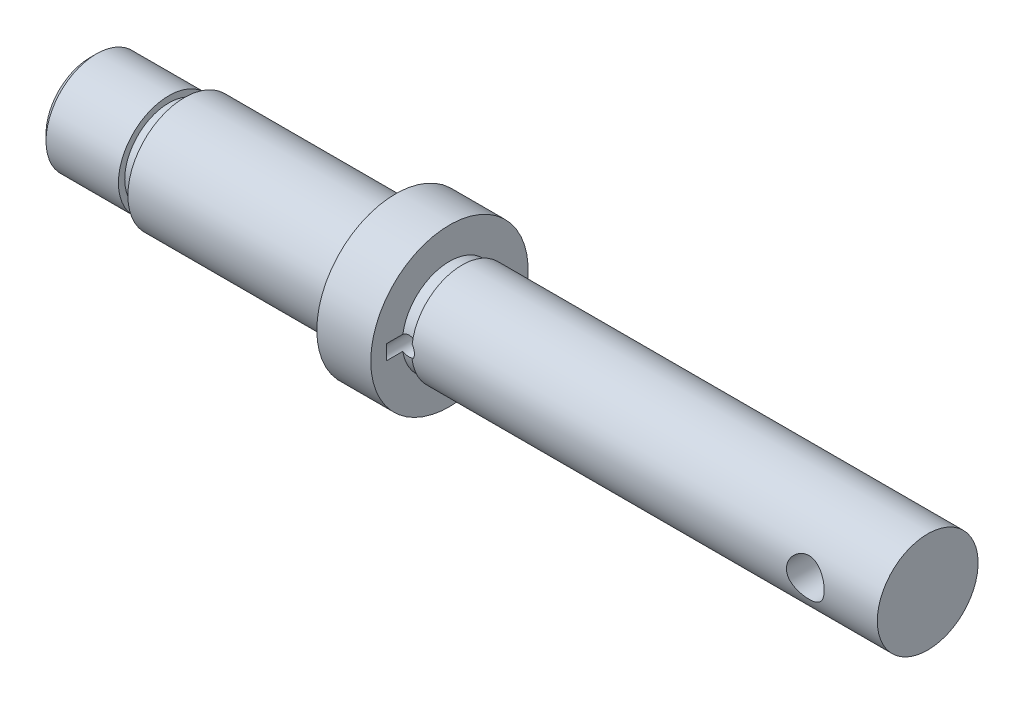
ISO-10303-21;
HEADER;
FILE_DESCRIPTION(('STEP AP214'),'2;1');
FILE_NAME('part.step','',(''),(''),'','','');
FILE_SCHEMA(('AUTOMOTIVE_DESIGN { 1 0 10303 214 1 1 1 1 }'));
ENDSEC;
DATA;
#1=APPLICATION_CONTEXT('core data for automotive mechanical design processes');
#2=APPLICATION_PROTOCOL_DEFINITION('international standard','automotive_design',2000,#1);
#3=PRODUCT_CONTEXT('',#1,'mechanical');
#4=PRODUCT('Part','Part','',(#3));
#5=PRODUCT_RELATED_PRODUCT_CATEGORY('part','',(#4));
#6=PRODUCT_DEFINITION_FORMATION('','',#4);
#7=PRODUCT_DEFINITION_CONTEXT('part definition',#1,'design');
#8=PRODUCT_DEFINITION('design','',#6,#7);
#9=PRODUCT_DEFINITION_SHAPE('','',#8);
#10=(LENGTH_UNIT() NAMED_UNIT(*) SI_UNIT(.MILLI.,.METRE.));
#11=(NAMED_UNIT(*) PLANE_ANGLE_UNIT() SI_UNIT($,.RADIAN.));
#12=(NAMED_UNIT(*) SI_UNIT($,.STERADIAN.) SOLID_ANGLE_UNIT());
#13=UNCERTAINTY_MEASURE_WITH_UNIT(LENGTH_MEASURE(1.E-05),#10,'distance_accuracy_value','');
#14=(GEOMETRIC_REPRESENTATION_CONTEXT(3) GLOBAL_UNCERTAINTY_ASSIGNED_CONTEXT((#13)) GLOBAL_UNIT_ASSIGNED_CONTEXT((#10,
#11,#12)) REPRESENTATION_CONTEXT('',''));
#15=CARTESIAN_POINT('',(0.,0.,0.));
#16=DIRECTION('',(0.,0.,1.));
#17=DIRECTION('',(1.,0.,0.));
#18=AXIS2_PLACEMENT_3D('',#15,#16,#17);
#19=CARTESIAN_POINT('',(0.,0.,0.));
#20=DIRECTION('',(-1.,0.,0.));
#21=DIRECTION('',(0.,0.,1.));
#22=AXIS2_PLACEMENT_3D('',#19,#20,#21);
#23=CYLINDRICAL_SURFACE('',#22,8.);
#24=CARTESIAN_POINT('',(0.,0.,0.));
#25=DIRECTION('',(-1.,0.,0.));
#26=DIRECTION('',(0.,0.,1.));
#27=AXIS2_PLACEMENT_3D('',#24,#25,#26);
#28=CIRCLE('',#27,8.);
#29=CARTESIAN_POINT('',(0.,0.,8.));
#30=VERTEX_POINT('',#29);
#31=EDGE_CURVE('E105',#30,#30,#28,.T.);
#32=ORIENTED_EDGE('',*,*,#31,.T.);
#33=EDGE_LOOP('',(#32));
#34=FACE_BOUND('',#33,.T.);
#35=CARTESIAN_POINT('',(-8.43488690884217,0.,-8.));
#36=CARTESIAN_POINT('',(-8.43488110423595,0.162470117875706,-8.00000434912302));
#37=CARTESIAN_POINT('',(-8.44812642933894,0.324900483563584,-7.99500758566367));
#38=CARTESIAN_POINT('',(-8.50054329938203,0.644906904704722,-7.97557392013855));
#39=CARTESIAN_POINT('',(-8.53971110978331,0.802483655975232,-7.96113837787987));
#40=CARTESIAN_POINT('',(-8.64239291238569,1.10812156998176,-7.92437664783088));
#41=CARTESIAN_POINT('',(-8.70585994248575,1.25620044832455,-7.90206568698877));
#42=CARTESIAN_POINT('',(-8.85509973487381,1.53959862032051,-7.85177535530709));
#43=CARTESIAN_POINT('',(-8.94087847993048,1.67491447835576,-7.82379446455106));
#44=CARTESIAN_POINT('',(-9.136111970984,1.93469283409165,-7.76372493942421));
#45=CARTESIAN_POINT('',(-9.24634743336101,2.05854146030237,-7.73152005167087));
#46=CARTESIAN_POINT('',(-9.48570777815983,2.28648842948728,-7.66720441742698));
#47=CARTESIAN_POINT('',(-9.6148384210178,2.39058072718411,-7.63509370270231));
#48=CARTESIAN_POINT('',(-9.89432184388871,2.57996404431964,-7.57324941235289));
#49=CARTESIAN_POINT('',(-10.0452956419343,2.66438786391495,-7.5436529764098));
#50=CARTESIAN_POINT('',(-10.3605836171788,2.80637292668193,-7.49199720475522));
#51=CARTESIAN_POINT('',(-10.5248924351506,2.86394489922567,-7.46993485954214));
#52=CARTESIAN_POINT('',(-10.8551203893602,2.94816862035013,-7.43708825645919));
#53=CARTESIAN_POINT('',(-11.0206969857191,2.97599186436803,-7.42587848693063));
#54=CARTESIAN_POINT('',(-11.3545192248238,3.00359113063608,-7.41476122931038));
#55=CARTESIAN_POINT('',(-11.5227637365685,3.00337873606425,-7.41484907350686));
#56=CARTESIAN_POINT('',(-11.8464259592993,2.97580859218857,-7.42595023233986));
#57=CARTESIAN_POINT('',(-12.0020087210274,2.95007617013711,-7.43630937632964));
#58=CARTESIAN_POINT('',(-12.3064612097447,2.87488335732475,-7.46569876010067));
#59=CARTESIAN_POINT('',(-12.4553299220912,2.82541939325577,-7.48473030568194));
#60=CARTESIAN_POINT('',(-12.7454410442687,2.70327497145115,-7.52971404410466));
#61=CARTESIAN_POINT('',(-12.8864858810767,2.63017297474552,-7.55579035984378));
#62=CARTESIAN_POINT('',(-13.1547783840322,2.46312147525044,-7.61188420270589));
#63=CARTESIAN_POINT('',(-13.2820212638838,2.36916477457696,-7.64190308912093));
#64=CARTESIAN_POINT('',(-13.5280942361416,2.15563561533201,-7.70496077720597));
#65=CARTESIAN_POINT('',(-13.6457841903377,2.03476597433939,-7.73806694911977));
#66=CARTESIAN_POINT('',(-13.8595628412544,1.77462518163777,-7.80183456327535));
#67=CARTESIAN_POINT('',(-13.9556482180537,1.63535120699465,-7.83249562931732));
#68=CARTESIAN_POINT('',(-14.124747702967,1.33944687398492,-7.88852789618334));
#69=CARTESIAN_POINT('',(-14.1973820712843,1.18258142768946,-7.91380996519278));
#70=CARTESIAN_POINT('',(-14.3148521173823,0.857673701049149,-7.95557436653877));
#71=CARTESIAN_POINT('',(-14.3597001419644,0.689636421691532,-7.97206060682974));
#72=CARTESIAN_POINT('',(-14.418132483926,0.356750486297338,-7.99368886456141));
#73=CARTESIAN_POINT('',(-14.4332521216072,0.192207239124422,-7.99938738051375));
#74=CARTESIAN_POINT('',(-14.436269036642,-0.137144950510048,-8.00051787400248));
#75=CARTESIAN_POINT('',(-14.4241723494757,-0.301953825966744,-7.99595212773725));
#76=CARTESIAN_POINT('',(-14.3742668242248,-0.620524097123716,-7.97743419545287));
#77=CARTESIAN_POINT('',(-14.337463821368,-0.77446665601467,-7.96384941924609));
#78=CARTESIAN_POINT('',(-14.2405147637475,-1.07388350991444,-7.92902954183434));
#79=CARTESIAN_POINT('',(-14.1803656729461,-1.21935670069507,-7.9077934456406));
#80=CARTESIAN_POINT('',(-14.0365140839632,-1.50249553022031,-7.85899248815363));
#81=CARTESIAN_POINT('',(-13.9521714503954,-1.63980616711559,-7.83126000418696));
#82=CARTESIAN_POINT('',(-13.7630507024991,-1.89878542345325,-7.77253343129327));
#83=CARTESIAN_POINT('',(-13.6582650437519,-2.0204482405409,-7.74153814019032));
#84=CARTESIAN_POINT('',(-13.4240786645936,-2.25206159748908,-7.67746658981979));
#85=CARTESIAN_POINT('',(-13.2936025432968,-2.36092308247137,-7.64437393007458));
#86=CARTESIAN_POINT('',(-13.0155841394269,-2.55542100063806,-7.58157631493707));
#87=CARTESIAN_POINT('',(-12.8680403260652,-2.64105534829037,-7.55187166388798));
#88=CARTESIAN_POINT('',(-12.5588549352975,-2.78675547037995,-7.49933659644926));
#89=CARTESIAN_POINT('',(-12.3971574170213,-2.84671370893836,-7.47653520656986));
#90=CARTESIAN_POINT('',(-12.0648673814665,-2.93815766933778,-7.4410806578201));
#91=CARTESIAN_POINT('',(-11.8942804364459,-2.9696610061107,-7.42842122114981));
#92=CARTESIAN_POINT('',(-11.5608545897599,-3.00172694195678,-7.41551789585146));
#93=CARTESIAN_POINT('',(-11.3982216454084,-3.00414662991675,-7.41452889046681));
#94=CARTESIAN_POINT('',(-11.0749962762898,-2.98273431283185,-7.42316825490584));
#95=CARTESIAN_POINT('',(-10.914403659499,-2.95890479700247,-7.43279561797797));
#96=CARTESIAN_POINT('',(-10.6047924554091,-2.88711631260483,-7.46096283170865));
#97=CARTESIAN_POINT('',(-10.4555702163515,-2.83991596633048,-7.47922170753325));
#98=CARTESIAN_POINT('',(-10.1670758918533,-2.72339393559839,-7.52243096595689));
#99=CARTESIAN_POINT('',(-10.0278063327019,-2.65406665889889,-7.54738303990429));
#100=CARTESIAN_POINT('',(-9.75523332944691,-2.49104151876308,-7.60279447807929));
#101=CARTESIAN_POINT('',(-9.62262531524235,-2.39625665606021,-7.63347396881928));
#102=CARTESIAN_POINT('',(-9.37460378689977,-2.18668971459812,-7.69612493514354));
#103=CARTESIAN_POINT('',(-9.25919575926867,-2.07190128025617,-7.7280968188629));
#104=CARTESIAN_POINT('',(-9.04248299719849,-1.81816079356925,-7.79180849219762));
#105=CARTESIAN_POINT('',(-8.94227940197283,-1.67823728842599,-7.82344209801289));
#106=CARTESIAN_POINT('',(-8.76684159828906,-1.38242644640164,-7.88109028914061));
#107=CARTESIAN_POINT('',(-8.69160933336943,-1.22653786818124,-7.90710443703118));
#108=CARTESIAN_POINT('',(-8.56613325074552,-0.895998164004625,-7.9514858521336));
#109=CARTESIAN_POINT('',(-8.51711277963838,-0.720826844468417,-7.96947314316712));
#110=CARTESIAN_POINT('',(-8.45150098900081,-0.363751467212764,-7.99372484359173));
#111=CARTESIAN_POINT('',(-8.43489340586753,-0.181850832729718,-7.99999513207934));
#112=CARTESIAN_POINT('',(-8.43488690884217,0.,-8.));
#113=B_SPLINE_CURVE_WITH_KNOTS('',3,(#35,#36,#37,#38,#39,#40,#41,#42,#43,#44,#45,#46,#47,#48,
#49,#50,#51,#52,#53,#54,#55,#56,#57,#58,#59,#60,#61,#62,#63,#64,#65,#66,#67,#68,#69,#70,#71,#72,
#73,#74,#75,#76,#77,#78,#79,#80,#81,#82,#83,#84,#85,#86,#87,#88,#89,#90,#91,#92,#93,#94,#95,#96,
#97,#98,#99,#100,#101,#102,#103,#104,#105,#106,#107,#108,#109,#110,#111,#112),.UNSPECIFIED.,.T.,
.F.,(4,2,2,2,2,2,2,2,2,2,2,2,2,2,2,2,2,2,2,2,2,2,2,2,2,2,2,2,2,2,2,2,2,2,2,2,2,2,4),(0.,
0.48673960312112,0.973409099060921,1.45914273842714,1.94500675921898,2.44947237165431,
2.95409209851243,3.47793349003317,4.00156538704268,4.50371748833803,5.00566212159415,
5.47756690242935,5.94954276126852,6.43044816779711,6.91151981494191,7.424923066773,
7.93840515815806,8.45982750577825,8.98101799403366,9.47450039277525,9.96787336786715,
10.4422887585335,10.9167658651458,11.4051844372487,11.8937836004541,12.4107303891699,
12.9277235784596,13.4468613346008,13.9656774991869,14.4511752696618,14.9366270042819,
15.4072628485874,15.8780177331869,16.3734494377422,16.869038839998,17.3914465931375,
17.9138949961588,18.4589703006976,19.0037720359793),.UNSPECIFIED.);
#114=CARTESIAN_POINT('',(-8.43488690884217,0.,-8.));
#115=VERTEX_POINT('',#114);
#116=EDGE_CURVE('E122',#115,#115,#113,.T.);
#117=ORIENTED_EDGE('',*,*,#116,.T.);
#118=EDGE_LOOP('',(#117));
#119=FACE_BOUND('',#118,.T.);
#120=CARTESIAN_POINT('',(-8.43488690884217,0.,8.));
#121=CARTESIAN_POINT('',(-8.43488110423595,-0.162470117875706,8.00000434912302));
#122=CARTESIAN_POINT('',(-8.44812642933894,-0.324900483563584,7.99500758566367));
#123=CARTESIAN_POINT('',(-8.50054329938203,-0.644906904704722,7.97557392013855));
#124=CARTESIAN_POINT('',(-8.53971110978331,-0.802483655975232,7.96113837787987));
#125=CARTESIAN_POINT('',(-8.64239291238569,-1.10812156998176,7.92437664783088));
#126=CARTESIAN_POINT('',(-8.70585994248575,-1.25620044832455,7.90206568698877));
#127=CARTESIAN_POINT('',(-8.85509973487381,-1.53959862032051,7.85177535530709));
#128=CARTESIAN_POINT('',(-8.94087847993048,-1.67491447835576,7.82379446455106));
#129=CARTESIAN_POINT('',(-9.136111970984,-1.93469283409165,7.76372493942421));
#130=CARTESIAN_POINT('',(-9.24634743336101,-2.05854146030237,7.73152005167087));
#131=CARTESIAN_POINT('',(-9.48570777815983,-2.28648842948728,7.66720441742698));
#132=CARTESIAN_POINT('',(-9.6148384210178,-2.39058072718411,7.63509370270231));
#133=CARTESIAN_POINT('',(-9.89432184388871,-2.57996404431964,7.57324941235289));
#134=CARTESIAN_POINT('',(-10.0452956419343,-2.66438786391495,7.5436529764098));
#135=CARTESIAN_POINT('',(-10.3605836171788,-2.80637292668193,7.49199720475522));
#136=CARTESIAN_POINT('',(-10.5248924351506,-2.86394489922567,7.46993485954214));
#137=CARTESIAN_POINT('',(-10.8551203893602,-2.94816862035013,7.43708825645919));
#138=CARTESIAN_POINT('',(-11.0206969857191,-2.97599186436803,7.42587848693063));
#139=CARTESIAN_POINT('',(-11.3545192248238,-3.00359113063608,7.41476122931038));
#140=CARTESIAN_POINT('',(-11.5227637365685,-3.00337873606425,7.41484907350686));
#141=CARTESIAN_POINT('',(-11.8464259592993,-2.97580859218857,7.42595023233986));
#142=CARTESIAN_POINT('',(-12.0020087210274,-2.95007617013711,7.43630937632964));
#143=CARTESIAN_POINT('',(-12.3064612097447,-2.87488335732475,7.46569876010067));
#144=CARTESIAN_POINT('',(-12.4553299220912,-2.82541939325577,7.48473030568194));
#145=CARTESIAN_POINT('',(-12.7454410442687,-2.70327497145115,7.52971404410466));
#146=CARTESIAN_POINT('',(-12.8864858810767,-2.63017297474552,7.55579035984378));
#147=CARTESIAN_POINT('',(-13.1547783840322,-2.46312147525044,7.61188420270589));
#148=CARTESIAN_POINT('',(-13.2820212638838,-2.36916477457696,7.64190308912093));
#149=CARTESIAN_POINT('',(-13.5280942361416,-2.15563561533201,7.70496077720597));
#150=CARTESIAN_POINT('',(-13.6457841903377,-2.03476597433939,7.73806694911977));
#151=CARTESIAN_POINT('',(-13.8595628412544,-1.77462518163777,7.80183456327535));
#152=CARTESIAN_POINT('',(-13.9556482180537,-1.63535120699465,7.83249562931732));
#153=CARTESIAN_POINT('',(-14.124747702967,-1.33944687398492,7.88852789618334));
#154=CARTESIAN_POINT('',(-14.1973820712843,-1.18258142768946,7.91380996519278));
#155=CARTESIAN_POINT('',(-14.3148521173823,-0.857673701049149,7.95557436653877));
#156=CARTESIAN_POINT('',(-14.3597001419644,-0.689636421691532,7.97206060682974));
#157=CARTESIAN_POINT('',(-14.418132483926,-0.356750486297338,7.99368886456141));
#158=CARTESIAN_POINT('',(-14.4332521216072,-0.192207239124422,7.99938738051375));
#159=CARTESIAN_POINT('',(-14.436269036642,0.137144950510048,8.00051787400248));
#160=CARTESIAN_POINT('',(-14.4241723494757,0.301953825966744,7.99595212773725));
#161=CARTESIAN_POINT('',(-14.3742668242248,0.620524097123716,7.97743419545287));
#162=CARTESIAN_POINT('',(-14.337463821368,0.77446665601467,7.96384941924609));
#163=CARTESIAN_POINT('',(-14.2405147637475,1.07388350991444,7.92902954183434));
#164=CARTESIAN_POINT('',(-14.1803656729461,1.21935670069507,7.9077934456406));
#165=CARTESIAN_POINT('',(-14.0365140839632,1.50249553022031,7.85899248815363));
#166=CARTESIAN_POINT('',(-13.9521714503954,1.63980616711559,7.83126000418696));
#167=CARTESIAN_POINT('',(-13.7630507024991,1.89878542345325,7.77253343129327));
#168=CARTESIAN_POINT('',(-13.6582650437519,2.0204482405409,7.74153814019032));
#169=CARTESIAN_POINT('',(-13.4240786645936,2.25206159748908,7.67746658981979));
#170=CARTESIAN_POINT('',(-13.2936025432968,2.36092308247137,7.64437393007458));
#171=CARTESIAN_POINT('',(-13.0155841394269,2.55542100063806,7.58157631493707));
#172=CARTESIAN_POINT('',(-12.8680403260652,2.64105534829037,7.55187166388798));
#173=CARTESIAN_POINT('',(-12.5588549352975,2.78675547037995,7.49933659644926));
#174=CARTESIAN_POINT('',(-12.3971574170213,2.84671370893836,7.47653520656986));
#175=CARTESIAN_POINT('',(-12.0648673814665,2.93815766933778,7.4410806578201));
#176=CARTESIAN_POINT('',(-11.8942804364459,2.9696610061107,7.42842122114981));
#177=CARTESIAN_POINT('',(-11.5608545897599,3.00172694195678,7.41551789585146));
#178=CARTESIAN_POINT('',(-11.3982216454084,3.00414662991675,7.41452889046681));
#179=CARTESIAN_POINT('',(-11.0749962762898,2.98273431283185,7.42316825490584));
#180=CARTESIAN_POINT('',(-10.914403659499,2.95890479700247,7.43279561797797));
#181=CARTESIAN_POINT('',(-10.6047924554091,2.88711631260483,7.46096283170865));
#182=CARTESIAN_POINT('',(-10.4555702163515,2.83991596633048,7.47922170753325));
#183=CARTESIAN_POINT('',(-10.1670758918533,2.72339393559839,7.52243096595689));
#184=CARTESIAN_POINT('',(-10.0278063327019,2.65406665889889,7.54738303990429));
#185=CARTESIAN_POINT('',(-9.75523332944691,2.49104151876308,7.60279447807929));
#186=CARTESIAN_POINT('',(-9.62262531524235,2.39625665606021,7.63347396881928));
#187=CARTESIAN_POINT('',(-9.37460378689977,2.18668971459812,7.69612493514354));
#188=CARTESIAN_POINT('',(-9.25919575926867,2.07190128025617,7.7280968188629));
#189=CARTESIAN_POINT('',(-9.04248299719849,1.81816079356925,7.79180849219762));
#190=CARTESIAN_POINT('',(-8.94227940197283,1.67823728842599,7.82344209801289));
#191=CARTESIAN_POINT('',(-8.76684159828906,1.38242644640164,7.88109028914061));
#192=CARTESIAN_POINT('',(-8.69160933336943,1.22653786818124,7.90710443703118));
#193=CARTESIAN_POINT('',(-8.56613325074552,0.895998164004625,7.9514858521336));
#194=CARTESIAN_POINT('',(-8.51711277963838,0.720826844468417,7.96947314316712));
#195=CARTESIAN_POINT('',(-8.45150098900081,0.363751467212764,7.99372484359173));
#196=CARTESIAN_POINT('',(-8.43489340586753,0.181850832729718,7.99999513207934));
#197=CARTESIAN_POINT('',(-8.43488690884217,0.,8.));
#198=B_SPLINE_CURVE_WITH_KNOTS('',3,(#120,#121,#122,#123,#124,#125,#126,#127,#128,#129,#130,
#131,#132,#133,#134,#135,#136,#137,#138,#139,#140,#141,#142,#143,#144,#145,#146,#147,#148,#149,
#150,#151,#152,#153,#154,#155,#156,#157,#158,#159,#160,#161,#162,#163,#164,#165,#166,#167,#168,
#169,#170,#171,#172,#173,#174,#175,#176,#177,#178,#179,#180,#181,#182,#183,#184,#185,#186,#187,
#188,#189,#190,#191,#192,#193,#194,#195,#196,#197),.UNSPECIFIED.,.T.,.F.,(4,2,2,2,2,2,2,2,2,2,2,
2,2,2,2,2,2,2,2,2,2,2,2,2,2,2,2,2,2,2,2,2,2,2,2,2,2,2,4),(0.,0.48673960312112,0.973409099060921,
1.45914273842714,1.94500675921898,2.44947237165431,2.95409209851243,3.47793349003317,
4.00156538704268,4.50371748833803,5.00566212159415,5.47756690242935,5.94954276126852,
6.43044816779711,6.91151981494191,7.424923066773,7.93840515815806,8.45982750577825,
8.98101799403366,9.47450039277525,9.96787336786715,10.4422887585335,10.9167658651458,
11.4051844372487,11.8937836004541,12.4107303891699,12.9277235784596,13.4468613346008,
13.9656774991869,14.4511752696618,14.9366270042819,15.4072628485874,15.8780177331869,
16.3734494377422,16.869038839998,17.3914465931375,17.9138949961588,18.4589703006976,
19.0037720359793),.UNSPECIFIED.);
#199=CARTESIAN_POINT('',(-8.43488690884217,0.,8.));
#200=VERTEX_POINT('',#199);
#201=EDGE_CURVE('E114',#200,#200,#198,.T.);
#202=ORIENTED_EDGE('',*,*,#201,.T.);
#203=EDGE_LOOP('',(#202));
#204=FACE_BOUND('',#203,.T.);
#205=CARTESIAN_POINT('',(-73.9348869088422,-1.05618847893945,7.92997262901679));
#206=CARTESIAN_POINT('',(-73.9052739556096,-1.02632416951052,7.93395026615026));
#207=CARTESIAN_POINT('',(-73.8769301635699,-0.995228402913589,7.93791992458012));
#208=CARTESIAN_POINT('',(-73.8229450184406,-0.930758570493962,7.94573753142004));
#209=CARTESIAN_POINT('',(-73.797303703623,-0.897384472417004,7.9495854781059));
#210=CARTESIAN_POINT('',(-73.724728715722,-0.79419097562321,7.96078056492474));
#211=CARTESIAN_POINT('',(-73.6820848174073,-0.721240604808903,7.96778723242894));
#212=CARTESIAN_POINT('',(-73.6095782815059,-0.569073794634865,7.98009942239746));
#213=CARTESIAN_POINT('',(-73.5797262410669,-0.489852224143204,7.98540353350535));
#214=CARTESIAN_POINT('',(-73.5337441245777,-0.327427823716092,7.99370950025806));
#215=CARTESIAN_POINT('',(-73.5176077558881,-0.244226838031143,7.99671241161244));
#216=CARTESIAN_POINT('',(-73.4996594270303,-0.0771853313498899,8.00005898376508));
#217=CARTESIAN_POINT('',(-73.4976895855359,0.00663768463714937,8.00043195348811));
#218=CARTESIAN_POINT('',(-73.5077194887055,0.17343226557318,7.99855472732908));
#219=CARTESIAN_POINT('',(-73.519721883936,0.256403665956043,7.99630403373175));
#220=CARTESIAN_POINT('',(-73.5571875424326,0.418534679332189,7.98945395382498));
#221=CARTESIAN_POINT('',(-73.5825582655844,0.497716464660166,7.98487072149909));
#222=CARTESIAN_POINT('',(-73.6459506264059,0.650689841306847,7.97386240401827));
#223=CARTESIAN_POINT('',(-73.6839671050425,0.724483615801353,7.9674380701172));
#224=CARTESIAN_POINT('',(-73.7573029173122,0.841917983630088,7.95571797405833));
#225=CARTESIAN_POINT('',(-73.7894970939228,0.887575011909834,7.95073209187361));
#226=CARTESIAN_POINT('',(-73.8586864986466,0.974939305734814,7.94049317400849));
#227=CARTESIAN_POINT('',(-73.8956738559005,1.01665285678915,7.93524058470219));
#228=CARTESIAN_POINT('',(-73.9348869088422,1.05618847893945,7.92997262901679));
#229=B_SPLINE_CURVE_WITH_KNOTS('',3,(#205,#206,#207,#208,#209,#210,#211,#212,#213,#214,#215,
#216,#217,#218,#219,#220,#221,#222,#223,#224,#225,#226,#227,#228),.UNSPECIFIED.,.F.,.F.,(4,2,2,
2,2,2,2,2,2,2,2,4),(0.,0.126657745911478,0.253317285284476,0.506385995258268,0.7596639513035,
1.01282564264968,1.26316149402208,1.51354484243904,1.76221729180274,2.0107884155307,
2.17872948218573,2.34639818764562),.UNSPECIFIED.);
#230=CARTESIAN_POINT('',(-73.9348869088422,-1.05618847893945,7.92997262901679));
#231=VERTEX_POINT('',#230);
#232=CARTESIAN_POINT('',(-73.9348869088422,1.05618847893945,7.92997262901679));
#233=VERTEX_POINT('',#232);
#234=EDGE_CURVE('E297',#231,#233,#229,.T.);
#235=ORIENTED_EDGE('',*,*,#234,.F.);
#236=CARTESIAN_POINT('',(-73.9348869088422,0.,0.));
#237=DIRECTION('',(-1.,0.,0.));
#238=DIRECTION('',(0.,0.,1.));
#239=AXIS2_PLACEMENT_3D('',#236,#237,#238);
#240=CIRCLE('',#239,7.99999999999999);
#241=EDGE_CURVE('E185',#233,#231,#240,.T.);
#242=ORIENTED_EDGE('',*,*,#241,.F.);
#243=EDGE_LOOP('',(#235,#242));
#244=FACE_BOUND('',#243,.T.);
#245=ADVANCED_FACE('F48',(#34,#119,#204,#244),#23,.T.);
#246=CARTESIAN_POINT('',(-73.9348869088422,7.99999999999999,0.));
#247=DIRECTION('',(1.,0.,0.));
#248=DIRECTION('',(0.,0.,-1.));
#249=AXIS2_PLACEMENT_3D('',#246,#247,#248);
#250=PLANE('',#249);
#251=DIRECTION('',(0.,0.,-1.));
#252=VECTOR('',#251,1.);
#253=CARTESIAN_POINT('',(-73.9348869088422,-1.05618847893945,10.));
#254=LINE('',#253,#252);
#255=CARTESIAN_POINT('',(-73.9348869088422,-1.05618847893945,7.42525864175487));
#256=VERTEX_POINT('',#255);
#257=EDGE_CURVE('E303',#256,#231,#254,.F.);
#258=ORIENTED_EDGE('',*,*,#257,.F.);
#259=CARTESIAN_POINT('',(-73.9348869088422,0.,0.));
#260=DIRECTION('',(-1.,0.,0.));
#261=DIRECTION('',(0.,0.,1.));
#262=AXIS2_PLACEMENT_3D('',#259,#260,#261);
#263=CIRCLE('',#262,7.49999999999998);
#264=CARTESIAN_POINT('',(-73.9348869088422,1.05618847893945,7.42525864175487));
#265=VERTEX_POINT('',#264);
#266=EDGE_CURVE('E178',#265,#256,#263,.T.);
#267=ORIENTED_EDGE('',*,*,#266,.F.);
#268=DIRECTION('',(0.,0.,-1.));
#269=VECTOR('',#268,1.);
#270=CARTESIAN_POINT('',(-73.9348869088422,1.05618847893945,10.));
#271=LINE('',#270,#269);
#272=EDGE_CURVE('E294',#233,#265,#271,.T.);
#273=ORIENTED_EDGE('',*,*,#272,.F.);
#274=ORIENTED_EDGE('',*,*,#241,.T.);
#275=EDGE_LOOP('',(#258,#267,#273,#274));
#276=FACE_BOUND('',#275,.T.);
#277=ADVANCED_FACE('F277',(#276),#250,.F.);
#278=CARTESIAN_POINT('',(0.,0.,0.));
#279=DIRECTION('',(-1.,0.,0.));
#280=DIRECTION('',(0.,0.,1.));
#281=AXIS2_PLACEMENT_3D('',#278,#279,#280);
#282=CYLINDRICAL_SURFACE('',#281,7.49999999999998);
#283=CARTESIAN_POINT('',(-73.9348869088422,1.05618847893945,7.42525864175487));
#284=CARTESIAN_POINT('',(-73.9645034997529,1.08605407997521,7.42101051166908));
#285=CARTESIAN_POINT('',(-73.9953613502676,1.11465991313782,7.41675769333779));
#286=CARTESIAN_POINT('',(-74.0593778004946,1.1691877675349,7.40835747563366));
#287=CARTESIAN_POINT('',(-74.0925364449052,1.19510973660444,7.40421007831103));
#288=CARTESIAN_POINT('',(-74.1951339446881,1.26856226470175,7.39210497646971));
#289=CARTESIAN_POINT('',(-74.2677426964261,1.31182811282179,7.3844771444272));
#290=CARTESIAN_POINT('',(-74.4193570691356,1.38563235857605,7.37098648855983));
#291=CARTESIAN_POINT('',(-74.4983682269115,1.41615959650023,7.36512521357731));
#292=CARTESIAN_POINT('',(-74.6605029164948,1.46351091517499,7.35586312751833));
#293=CARTESIAN_POINT('',(-74.7436240290808,1.48034295775632,7.35246088698771));
#294=CARTESIAN_POINT('',(-74.9104772288962,1.4996495286515,7.34854740317055));
#295=CARTESIAN_POINT('',(-74.9941871007483,1.50230898819262,7.34799892476273));
#296=CARTESIAN_POINT('',(-75.1608938981907,1.49367997754281,7.34975771073893));
#297=CARTESIAN_POINT('',(-75.2438905097933,1.48238565260297,7.35206617384328));
#298=CARTESIAN_POINT('',(-75.4060338541891,1.44636812999615,7.35923565084623));
#299=CARTESIAN_POINT('',(-75.4852073948273,1.42176034318341,7.36407471576013));
#300=CARTESIAN_POINT('',(-75.6382472246662,1.35993873321895,7.37574042113748));
#301=CARTESIAN_POINT('',(-75.712119911548,1.3227404268145,7.38256461365144));
#302=CARTESIAN_POINT('',(-75.8088674021788,1.26360836584886,7.39280479025455));
#303=CARTESIAN_POINT('',(-75.8348878167623,1.24656763151928,7.39570114123462));
#304=CARTESIAN_POINT('',(-75.885763525362,1.21094309498924,7.40161756985707));
#305=CARTESIAN_POINT('',(-75.9106208722926,1.19236218550369,7.40463741038993));
#306=CARTESIAN_POINT('',(-75.9348869088422,1.17302449576951,7.40769961137224));
#307=B_SPLINE_CURVE_WITH_KNOTS('',3,(#283,#284,#285,#286,#287,#288,#289,#290,#291,#292,#293,
#294,#295,#296,#297,#298,#299,#300,#301,#302,#303,#304,#305,#306),.UNSPECIFIED.,.F.,.F.,(4,2,2,
2,2,2,2,2,2,2,2,4),(0.,0.126747026296717,0.253496515649995,0.506791190230801,0.760307301108847,
1.01367592248813,1.26373021514847,1.51388946158826,1.76191410064953,2.00963417668388,
2.10330318988051,2.19680009844318),.UNSPECIFIED.);
#308=CARTESIAN_POINT('',(-75.9348869088422,1.17302449576952,7.40769961137224));
#309=VERTEX_POINT('',#308);
#310=EDGE_CURVE('E290',#265,#309,#307,.T.);
#311=ORIENTED_EDGE('',*,*,#310,.F.);
#312=ORIENTED_EDGE('',*,*,#266,.T.);
#313=CARTESIAN_POINT('',(-75.9348869088422,-1.17302449576952,7.40769961137224));
#314=CARTESIAN_POINT('',(-75.9021744375618,-1.19909491722423,7.40357091690932));
#315=CARTESIAN_POINT('',(-75.868380865978,-1.22379010179505,7.39951978500214));
#316=CARTESIAN_POINT('',(-75.7988273683287,-1.27028622094918,7.39167973697307));
#317=CARTESIAN_POINT('',(-75.7630673535095,-1.29208702474538,7.38789083270405));
#318=CARTESIAN_POINT('',(-75.6532024459161,-1.35289206825027,7.37708520011737));
#319=CARTESIAN_POINT('',(-75.5764526810604,-1.38734671232317,7.37062168058485));
#320=CARTESIAN_POINT('',(-75.418092532329,-1.44300306143001,7.35992889206577));
#321=CARTESIAN_POINT('',(-75.3364774478198,-1.46419171456118,7.35570182407003));
#322=CARTESIAN_POINT('',(-75.1707904824014,-1.49261048640347,7.34998825631664));
#323=CARTESIAN_POINT('',(-75.0867200579257,-1.49984871597839,7.34850016412395));
#324=CARTESIAN_POINT('',(-74.9196467609824,-1.50014471216213,7.34843963476046));
#325=CARTESIAN_POINT('',(-74.8366441224258,-1.49338439478903,7.34982979368093));
#326=CARTESIAN_POINT('',(-74.6729413989177,-1.46625977959111,7.35528857910337));
#327=CARTESIAN_POINT('',(-74.592242455284,-1.4458888565856,7.35935851001332));
#328=CARTESIAN_POINT('',(-74.4355030531643,-1.3921952152797,7.36970387720376));
#329=CARTESIAN_POINT('',(-74.3594597908246,-1.35888038297496,7.37597797038966));
#330=CARTESIAN_POINT('',(-74.2140582094021,-1.28027651592592,7.3900252447978));
#331=CARTESIAN_POINT('',(-74.1446918933979,-1.23500205485741,7.39779659840105));
#332=CARTESIAN_POINT('',(-74.0541026999054,-1.16461408211611,7.40905365828701));
#333=CARTESIAN_POINT('',(-74.0292581159902,-1.14398606122459,7.41227121097553));
#334=CARTESIAN_POINT('',(-73.9809978015376,-1.1012129273539,7.41874633707051));
#335=CARTESIAN_POINT('',(-73.9575795620776,-1.0790706327552,7.42200382734052));
#336=CARTESIAN_POINT('',(-73.9348869088422,-1.05618847893945,7.42525864175487));
#337=B_SPLINE_CURVE_WITH_KNOTS('',3,(#313,#314,#315,#316,#317,#318,#319,#320,#321,#322,#323,
#324,#325,#326,#327,#328,#329,#330,#331,#332,#333,#334,#335,#336),.UNSPECIFIED.,.F.,.F.,(4,2,2,
2,2,2,2,2,2,2,2,4),(0.,0.126025370463864,0.252056433643391,0.503890142200176,0.755971232585985,
1.0079057171792,1.25658678016885,1.50538898093115,1.75403983760127,2.00238908181724,
2.09969210749874,2.19681871736391),.UNSPECIFIED.);
#338=CARTESIAN_POINT('',(-75.9348869088422,-1.17302449576952,7.40769961137224));
#339=VERTEX_POINT('',#338);
#340=EDGE_CURVE('E278',#339,#256,#337,.T.);
#341=ORIENTED_EDGE('',*,*,#340,.F.);
#342=CARTESIAN_POINT('',(-75.9348869088422,0.,0.));
#343=DIRECTION('',(-1.,0.,0.));
#344=DIRECTION('',(0.,0.,1.));
#345=AXIS2_PLACEMENT_3D('',#342,#343,#344);
#346=CIRCLE('',#345,7.49999999999998);
#347=EDGE_CURVE('E173',#309,#339,#346,.T.);
#348=ORIENTED_EDGE('',*,*,#347,.F.);
#349=EDGE_LOOP('',(#311,#312,#341,#348));
#350=FACE_BOUND('',#349,.T.);
#351=ADVANCED_FACE('F275',(#350),#282,.T.);
#352=CARTESIAN_POINT('',(-75.9348869088422,7.49999999999998,0.));
#353=DIRECTION('',(-1.,0.,0.));
#354=DIRECTION('',(0.,0.,1.));
#355=AXIS2_PLACEMENT_3D('',#352,#353,#354);
#356=PLANE('',#355);
#357=CARTESIAN_POINT('',(-75.9348869088422,0.,0.));
#358=DIRECTION('',(-1.,0.,0.));
#359=DIRECTION('',(0.,0.,1.));
#360=AXIS2_PLACEMENT_3D('',#357,#358,#359);
#361=CIRCLE('',#360,12.5);
#362=CARTESIAN_POINT('',(-75.9348869088422,0.,12.5));
#363=VERTEX_POINT('',#362);
#364=EDGE_CURVE('E168',#363,#363,#361,.T.);
#365=ORIENTED_EDGE('',*,*,#364,.F.);
#366=EDGE_LOOP('',(#365));
#367=FACE_BOUND('',#366,.T.);
#368=DIRECTION('',(0.,0.,-1.));
#369=VECTOR('',#368,1.);
#370=CARTESIAN_POINT('',(-75.9348869088422,1.17302449576952,10.));
#371=LINE('',#370,#369);
#372=CARTESIAN_POINT('',(-75.9348869088422,1.17302449576952,10.));
#373=VERTEX_POINT('',#372);
#374=EDGE_CURVE('E124',#309,#373,#371,.F.);
#375=ORIENTED_EDGE('',*,*,#374,.F.);
#376=ORIENTED_EDGE('',*,*,#347,.T.);
#377=DIRECTION('',(0.,0.,-1.));
#378=VECTOR('',#377,1.);
#379=CARTESIAN_POINT('',(-75.9348869088422,-1.17302449576952,10.));
#380=LINE('',#379,#378);
#381=CARTESIAN_POINT('',(-75.9348869088422,-1.17302449576952,10.));
#382=VERTEX_POINT('',#381);
#383=EDGE_CURVE('E107',#382,#339,#380,.T.);
#384=ORIENTED_EDGE('',*,*,#383,.F.);
#385=DIRECTION('',(0.,1.,0.));
#386=VECTOR('',#385,1.);
#387=CARTESIAN_POINT('',(-75.9348869088422,7.49999999999998,10.));
#388=LINE('',#387,#386);
#389=EDGE_CURVE('E101',#382,#373,#388,.T.);
#390=ORIENTED_EDGE('',*,*,#389,.T.);
#391=EDGE_LOOP('',(#375,#376,#384,#390));
#392=FACE_BOUND('',#391,.T.);
#393=ADVANCED_FACE('F220',(#367,#392),#356,.F.);
#394=CARTESIAN_POINT('',(-133.,0.,0.));
#395=DIRECTION('',(-1.,0.,0.));
#396=DIRECTION('',(0.,0.,1.));
#397=AXIS2_PLACEMENT_3D('',#394,#395,#396);
#398=CYLINDRICAL_SURFACE('',#397,1.5);
#399=CARTESIAN_POINT('',(-125.,0.,0.));
#400=DIRECTION('',(-1.,0.,0.));
#401=DIRECTION('',(0.,0.,1.));
#402=AXIS2_PLACEMENT_3D('',#399,#400,#401);
#403=CIRCLE('',#402,1.5);
#404=CARTESIAN_POINT('',(-125.,0.,1.5));
#405=VERTEX_POINT('',#404);
#406=EDGE_CURVE('E115',#405,#405,#403,.T.);
#407=ORIENTED_EDGE('',*,*,#406,.T.);
#408=EDGE_LOOP('',(#407));
#409=FACE_BOUND('',#408,.T.);
#410=CARTESIAN_POINT('',(-74.9999999999999,0.,0.));
#411=DIRECTION('',(-1.,0.,0.));
#412=DIRECTION('',(0.,0.,1.));
#413=AXIS2_PLACEMENT_3D('',#410,#411,#412);
#414=CIRCLE('',#413,1.5);
#415=CARTESIAN_POINT('',(-74.9999999999999,1.5,0.));
#416=VERTEX_POINT('',#415);
#417=CARTESIAN_POINT('',(-74.9999999999999,-1.5,0.));
#418=VERTEX_POINT('',#417);
#419=EDGE_CURVE('E106',#416,#418,#414,.T.);
#420=ORIENTED_EDGE('',*,*,#419,.F.);
#421=CARTESIAN_POINT('',(-74.9999999999999,0.,0.));
#422=DIRECTION('',(-0.707106781186547,0.,-0.707106781186547));
#423=DIRECTION('',(-0.707106781186547,0.,0.707106781186547));
#424=AXIS2_PLACEMENT_3D('',#421,#422,#423);
#425=ELLIPSE('',#424,2.12132034355964,1.5);
#426=EDGE_CURVE('E72',#416,#418,#425,.F.);
#427=ORIENTED_EDGE('',*,*,#426,.T.);
#428=EDGE_LOOP('',(#420,#427));
#429=FACE_BOUND('',#428,.T.);
#430=ADVANCED_FACE('F104',(#409,#429),#398,.F.);
#431=CARTESIAN_POINT('',(-74.9999999999999,0.,0.));
#432=DIRECTION('',(-1.,0.,0.));
#433=DIRECTION('',(0.,1.,0.));
#434=AXIS2_PLACEMENT_3D('',#431,#432,#433);
#435=SPHERICAL_SURFACE('',#434,1.5);
#436=ORIENTED_EDGE('',*,*,#419,.T.);
#437=CARTESIAN_POINT('',(-74.9999999999999,0.,0.));
#438=DIRECTION('',(0.,0.,1.));
#439=DIRECTION('',(1.,0.,0.));
#440=AXIS2_PLACEMENT_3D('',#437,#438,#439);
#441=CIRCLE('',#440,1.5);
#442=EDGE_CURVE('E94',#418,#416,#441,.T.);
#443=ORIENTED_EDGE('',*,*,#442,.T.);
#444=EDGE_LOOP('',(#436,#443));
#445=FACE_BOUND('',#444,.T.);
#446=ADVANCED_FACE('F109',(#445),#435,.F.);
#447=CARTESIAN_POINT('',(0.,0.,0.));
#448=DIRECTION('',(-1.,0.,0.));
#449=DIRECTION('',(0.,0.,1.));
#450=AXIS2_PLACEMENT_3D('',#447,#448,#449);
#451=PLANE('',#450);
#452=ORIENTED_EDGE('',*,*,#31,.F.);
#453=EDGE_LOOP('',(#452));
#454=FACE_BOUND('',#453,.T.);
#455=ADVANCED_FACE('F212',(#454),#451,.F.);
#456=CARTESIAN_POINT('',(0.,0.,0.));
#457=DIRECTION('',(-1.,0.,0.));
#458=DIRECTION('',(0.,0.,1.));
#459=AXIS2_PLACEMENT_3D('',#456,#457,#458);
#460=CYLINDRICAL_SURFACE('',#459,12.5);
#461=CARTESIAN_POINT('',(-84.5,0.,0.));
#462=DIRECTION('',(-1.,0.,0.));
#463=DIRECTION('',(0.,0.,1.));
#464=AXIS2_PLACEMENT_3D('',#461,#462,#463);
#465=CIRCLE('',#464,12.5);
#466=CARTESIAN_POINT('',(-84.5,0.,12.5));
#467=VERTEX_POINT('',#466);
#468=EDGE_CURVE('E167',#467,#467,#465,.T.);
#469=ORIENTED_EDGE('',*,*,#468,.F.);
#470=EDGE_LOOP('',(#469));
#471=FACE_BOUND('',#470,.T.);
#472=ORIENTED_EDGE('',*,*,#364,.T.);
#473=EDGE_LOOP('',(#472));
#474=FACE_BOUND('',#473,.T.);
#475=ADVANCED_FACE('F264',(#471,#474),#460,.T.);
#476=CARTESIAN_POINT('',(-84.5,12.5,0.));
#477=DIRECTION('',(1.,0.,0.));
#478=DIRECTION('',(0.,0.,-1.));
#479=AXIS2_PLACEMENT_3D('',#476,#477,#478);
#480=PLANE('',#479);
#481=CARTESIAN_POINT('',(-84.5,0.,0.));
#482=DIRECTION('',(-1.,0.,0.));
#483=DIRECTION('',(0.,0.,1.));
#484=AXIS2_PLACEMENT_3D('',#481,#482,#483);
#485=CIRCLE('',#484,8.5);
#486=CARTESIAN_POINT('',(-84.5,0.,8.5));
#487=VERTEX_POINT('',#486);
#488=EDGE_CURVE('E165',#487,#487,#485,.T.);
#489=ORIENTED_EDGE('',*,*,#488,.F.);
#490=EDGE_LOOP('',(#489));
#491=FACE_BOUND('',#490,.T.);
#492=ORIENTED_EDGE('',*,*,#468,.T.);
#493=EDGE_LOOP('',(#492));
#494=FACE_BOUND('',#493,.T.);
#495=ADVANCED_FACE('F261',(#491,#494),#480,.F.);
#496=CARTESIAN_POINT('',(0.,0.,0.));
#497=DIRECTION('',(-1.,0.,0.));
#498=DIRECTION('',(0.,0.,1.));
#499=AXIS2_PLACEMENT_3D('',#496,#497,#498);
#500=CYLINDRICAL_SURFACE('',#499,8.5);
#501=CARTESIAN_POINT('',(-86.5,0.,0.));
#502=DIRECTION('',(-1.,0.,0.));
#503=DIRECTION('',(0.,0.,1.));
#504=AXIS2_PLACEMENT_3D('',#501,#502,#503);
#505=CIRCLE('',#504,8.5);
#506=CARTESIAN_POINT('',(-86.5,0.,8.5));
#507=VERTEX_POINT('',#506);
#508=EDGE_CURVE('E158',#507,#507,#505,.T.);
#509=ORIENTED_EDGE('',*,*,#508,.F.);
#510=EDGE_LOOP('',(#509));
#511=FACE_BOUND('',#510,.T.);
#512=ORIENTED_EDGE('',*,*,#488,.T.);
#513=EDGE_LOOP('',(#512));
#514=FACE_BOUND('',#513,.T.);
#515=ADVANCED_FACE('F260',(#511,#514),#500,.T.);
#516=CARTESIAN_POINT('',(-86.5,8.5,0.));
#517=DIRECTION('',(-1.,0.,0.));
#518=DIRECTION('',(0.,0.,1.));
#519=AXIS2_PLACEMENT_3D('',#516,#517,#518);
#520=PLANE('',#519);
#521=CARTESIAN_POINT('',(-86.5,0.,0.));
#522=DIRECTION('',(-1.,0.,0.));
#523=DIRECTION('',(0.,0.,1.));
#524=AXIS2_PLACEMENT_3D('',#521,#522,#523);
#525=CIRCLE('',#524,9.);
#526=CARTESIAN_POINT('',(-86.5,0.,9.));
#527=VERTEX_POINT('',#526);
#528=EDGE_CURVE('E152',#527,#527,#525,.T.);
#529=ORIENTED_EDGE('',*,*,#528,.F.);
#530=EDGE_LOOP('',(#529));
#531=FACE_BOUND('',#530,.T.);
#532=ORIENTED_EDGE('',*,*,#508,.T.);
#533=EDGE_LOOP('',(#532));
#534=FACE_BOUND('',#533,.T.);
#535=ADVANCED_FACE('F251',(#531,#534),#520,.F.);
#536=CARTESIAN_POINT('',(0.,0.,0.));
#537=DIRECTION('',(-1.,0.,0.));
#538=DIRECTION('',(0.,0.,1.));
#539=AXIS2_PLACEMENT_3D('',#536,#537,#538);
#540=CYLINDRICAL_SURFACE('',#539,9.);
#541=CARTESIAN_POINT('',(-118.,0.,0.));
#542=DIRECTION('',(-1.,0.,0.));
#543=DIRECTION('',(0.,0.,1.));
#544=AXIS2_PLACEMENT_3D('',#541,#542,#543);
#545=CIRCLE('',#544,9.);
#546=CARTESIAN_POINT('',(-118.,0.,9.));
#547=VERTEX_POINT('',#546);
#548=EDGE_CURVE('E147',#547,#547,#545,.T.);
#549=ORIENTED_EDGE('',*,*,#548,.F.);
#550=EDGE_LOOP('',(#549));
#551=FACE_BOUND('',#550,.T.);
#552=ORIENTED_EDGE('',*,*,#528,.T.);
#553=EDGE_LOOP('',(#552));
#554=FACE_BOUND('',#553,.T.);
#555=ADVANCED_FACE('F249',(#551,#554),#540,.T.);
#556=CARTESIAN_POINT('',(-118.,9.,0.));
#557=DIRECTION('',(1.,0.,0.));
#558=DIRECTION('',(0.,0.,-1.));
#559=AXIS2_PLACEMENT_3D('',#556,#557,#558);
#560=PLANE('',#559);
#561=CARTESIAN_POINT('',(-118.,0.,0.));
#562=DIRECTION('',(-1.,0.,0.));
#563=DIRECTION('',(0.,0.,1.));
#564=AXIS2_PLACEMENT_3D('',#561,#562,#563);
#565=CIRCLE('',#564,7.);
#566=CARTESIAN_POINT('',(-118.,0.,7.));
#567=VERTEX_POINT('',#566);
#568=EDGE_CURVE('E148',#567,#567,#565,.T.);
#569=ORIENTED_EDGE('',*,*,#568,.F.);
#570=EDGE_LOOP('',(#569));
#571=FACE_BOUND('',#570,.T.);
#572=ORIENTED_EDGE('',*,*,#548,.T.);
#573=EDGE_LOOP('',(#572));
#574=FACE_BOUND('',#573,.T.);
#575=ADVANCED_FACE('F245',(#571,#574),#560,.F.);
#576=CARTESIAN_POINT('',(0.,0.,0.));
#577=DIRECTION('',(-1.,0.,0.));
#578=DIRECTION('',(0.,0.,1.));
#579=AXIS2_PLACEMENT_3D('',#576,#577,#578);
#580=CYLINDRICAL_SURFACE('',#579,7.);
#581=CARTESIAN_POINT('',(-120.5,0.,0.));
#582=DIRECTION('',(-1.,0.,0.));
#583=DIRECTION('',(0.,0.,1.));
#584=AXIS2_PLACEMENT_3D('',#581,#582,#583);
#585=CIRCLE('',#584,7.);
#586=CARTESIAN_POINT('',(-120.5,0.,7.));
#587=VERTEX_POINT('',#586);
#588=EDGE_CURVE('E142',#587,#587,#585,.T.);
#589=ORIENTED_EDGE('',*,*,#588,.F.);
#590=EDGE_LOOP('',(#589));
#591=FACE_BOUND('',#590,.T.);
#592=ORIENTED_EDGE('',*,*,#568,.T.);
#593=EDGE_LOOP('',(#592));
#594=FACE_BOUND('',#593,.T.);
#595=ADVANCED_FACE('F241',(#591,#594),#580,.T.);
#596=CARTESIAN_POINT('',(-120.5,7.,0.));
#597=DIRECTION('',(-1.,0.,0.));
#598=DIRECTION('',(0.,0.,1.));
#599=AXIS2_PLACEMENT_3D('',#596,#597,#598);
#600=PLANE('',#599);
#601=CARTESIAN_POINT('',(-120.5,0.,0.));
#602=DIRECTION('',(-1.,0.,0.));
#603=DIRECTION('',(0.,0.,1.));
#604=AXIS2_PLACEMENT_3D('',#601,#602,#603);
#605=CIRCLE('',#604,8.);
#606=CARTESIAN_POINT('',(-120.5,0.,8.));
#607=VERTEX_POINT('',#606);
#608=EDGE_CURVE('E138',#607,#607,#605,.T.);
#609=ORIENTED_EDGE('',*,*,#608,.F.);
#610=EDGE_LOOP('',(#609));
#611=FACE_BOUND('',#610,.T.);
#612=ORIENTED_EDGE('',*,*,#588,.T.);
#613=EDGE_LOOP('',(#612));
#614=FACE_BOUND('',#613,.T.);
#615=ADVANCED_FACE('F240',(#611,#614),#600,.F.);
#616=CARTESIAN_POINT('',(0.,0.,0.));
#617=DIRECTION('',(-1.,0.,0.));
#618=DIRECTION('',(0.,0.,1.));
#619=AXIS2_PLACEMENT_3D('',#616,#617,#618);
#620=CYLINDRICAL_SURFACE('',#619,8.);
#621=CARTESIAN_POINT('',(-132.,0.,0.));
#622=DIRECTION('',(1.,0.,0.));
#623=DIRECTION('',(0.,0.,-1.));
#624=AXIS2_PLACEMENT_3D('',#621,#622,#623);
#625=CIRCLE('',#624,8.);
#626=CARTESIAN_POINT('',(-132.,0.,-8.));
#627=VERTEX_POINT('',#626);
#628=EDGE_CURVE('E11',#627,#627,#625,.T.);
#629=ORIENTED_EDGE('',*,*,#628,.T.);
#630=EDGE_LOOP('',(#629));
#631=FACE_BOUND('',#630,.T.);
#632=ORIENTED_EDGE('',*,*,#608,.T.);
#633=EDGE_LOOP('',(#632));
#634=FACE_BOUND('',#633,.T.);
#635=ADVANCED_FACE('F233',(#631,#634),#620,.T.);
#636=CARTESIAN_POINT('',(-133.,8.00000000000001,0.));
#637=DIRECTION('',(1.,0.,0.));
#638=DIRECTION('',(0.,0.,-1.));
#639=AXIS2_PLACEMENT_3D('',#636,#637,#638);
#640=PLANE('',#639);
#641=CARTESIAN_POINT('',(-133.,0.,0.));
#642=DIRECTION('',(1.,0.,0.));
#643=DIRECTION('',(0.,0.,-1.));
#644=AXIS2_PLACEMENT_3D('',#641,#642,#643);
#645=CIRCLE('',#644,7.00000000000041);
#646=CARTESIAN_POINT('',(-133.,0.,-7.00000000000041));
#647=VERTEX_POINT('',#646);
#648=EDGE_CURVE('E59',#647,#647,#645,.F.);
#649=ORIENTED_EDGE('',*,*,#648,.T.);
#650=EDGE_LOOP('',(#649));
#651=FACE_BOUND('',#650,.T.);
#652=CARTESIAN_POINT('',(-133.,0.,0.));
#653=DIRECTION('',(-1.,0.,0.));
#654=DIRECTION('',(0.,0.,1.));
#655=AXIS2_PLACEMENT_3D('',#652,#653,#654);
#656=CIRCLE('',#655,3.86602540378444);
#657=CARTESIAN_POINT('',(-133.,0.,3.86602540378444));
#658=VERTEX_POINT('',#657);
#659=EDGE_CURVE('E133',#658,#658,#656,.T.);
#660=ORIENTED_EDGE('',*,*,#659,.F.);
#661=EDGE_LOOP('',(#660));
#662=FACE_BOUND('',#661,.T.);
#663=ADVANCED_FACE('F228',(#651,#662),#640,.F.);
#664=CARTESIAN_POINT('',(-131.5,0.,0.));
#665=DIRECTION('',(-1.,0.,0.));
#666=DIRECTION('',(0.,0.,1.));
#667=AXIS2_PLACEMENT_3D('',#664,#665,#666);
#668=CONICAL_SURFACE('',#667,3.,0.5235987755983);
#669=ORIENTED_EDGE('',*,*,#659,.T.);
#670=EDGE_LOOP('',(#669));
#671=FACE_BOUND('',#670,.T.);
#672=CARTESIAN_POINT('',(-131.5,0.,0.));
#673=DIRECTION('',(-1.,0.,0.));
#674=DIRECTION('',(0.,0.,1.));
#675=AXIS2_PLACEMENT_3D('',#672,#673,#674);
#676=CIRCLE('',#675,3.);
#677=CARTESIAN_POINT('',(-131.5,0.,3.));
#678=VERTEX_POINT('',#677);
#679=EDGE_CURVE('E128',#678,#678,#676,.T.);
#680=ORIENTED_EDGE('',*,*,#679,.F.);
#681=EDGE_LOOP('',(#680));
#682=FACE_BOUND('',#681,.T.);
#683=ADVANCED_FACE('F223',(#671,#682),#668,.F.);
#684=CARTESIAN_POINT('',(-133.,0.,0.));
#685=DIRECTION('',(-1.,0.,0.));
#686=DIRECTION('',(0.,0.,1.));
#687=AXIS2_PLACEMENT_3D('',#684,#685,#686);
#688=CYLINDRICAL_SURFACE('',#687,3.);
#689=ORIENTED_EDGE('',*,*,#679,.T.);
#690=EDGE_LOOP('',(#689));
#691=FACE_BOUND('',#690,.T.);
#692=CARTESIAN_POINT('',(-125.,0.,0.));
#693=DIRECTION('',(-1.,0.,0.));
#694=DIRECTION('',(0.,0.,1.));
#695=AXIS2_PLACEMENT_3D('',#692,#693,#694);
#696=CIRCLE('',#695,3.);
#697=CARTESIAN_POINT('',(-125.,0.,3.));
#698=VERTEX_POINT('',#697);
#699=EDGE_CURVE('E119',#698,#698,#696,.T.);
#700=ORIENTED_EDGE('',*,*,#699,.F.);
#701=EDGE_LOOP('',(#700));
#702=FACE_BOUND('',#701,.T.);
#703=ADVANCED_FACE('F222',(#691,#702),#688,.F.);
#704=CARTESIAN_POINT('',(-125.,3.,0.));
#705=DIRECTION('',(-1.,0.,0.));
#706=DIRECTION('',(0.,0.,1.));
#707=AXIS2_PLACEMENT_3D('',#704,#705,#706);
#708=PLANE('',#707);
#709=ORIENTED_EDGE('',*,*,#699,.T.);
#710=EDGE_LOOP('',(#709));
#711=FACE_BOUND('',#710,.T.);
#712=ORIENTED_EDGE('',*,*,#406,.F.);
#713=EDGE_LOOP('',(#712));
#714=FACE_BOUND('',#713,.T.);
#715=ADVANCED_FACE('F210',(#711,#714),#708,.T.);
#716=CARTESIAN_POINT('',(-11.4348869088422,0.,-12.5));
#717=DIRECTION('',(0.,0.,1.));
#718=DIRECTION('',(1.,0.,0.));
#719=AXIS2_PLACEMENT_3D('',#716,#717,#718);
#720=CYLINDRICAL_SURFACE('',#719,3.);
#721=ORIENTED_EDGE('',*,*,#116,.F.);
#722=EDGE_LOOP('',(#721));
#723=FACE_BOUND('',#722,.T.);
#724=ORIENTED_EDGE('',*,*,#201,.F.);
#725=EDGE_LOOP('',(#724));
#726=FACE_BOUND('',#725,.T.);
#727=ADVANCED_FACE('F203',(#723,#726),#720,.F.);
#728=CARTESIAN_POINT('',(-74.9999999999999,0.,10.));
#729=DIRECTION('',(0.,0.,1.));
#730=DIRECTION('',(1.,0.,0.));
#731=AXIS2_PLACEMENT_3D('',#728,#729,#730);
#732=PLANE('',#731);
#733=CARTESIAN_POINT('',(-74.9999999999999,0.,10.));
#734=DIRECTION('',(0.,0.,1.));
#735=DIRECTION('',(1.,0.,0.));
#736=AXIS2_PLACEMENT_3D('',#733,#734,#735);
#737=CIRCLE('',#736,1.5);
#738=EDGE_CURVE('E63',#373,#382,#737,.T.);
#739=ORIENTED_EDGE('',*,*,#738,.F.);
#740=ORIENTED_EDGE('',*,*,#389,.F.);
#741=EDGE_LOOP('',(#739,#740));
#742=FACE_BOUND('',#741,.T.);
#743=ADVANCED_FACE('F206',(#742),#732,.F.);
#744=CARTESIAN_POINT('',(-74.9999999999999,0.,10.));
#745=DIRECTION('',(0.,0.,-1.));
#746=DIRECTION('',(-1.,0.,0.));
#747=AXIS2_PLACEMENT_3D('',#744,#745,#746);
#748=CYLINDRICAL_SURFACE('',#747,1.5);
#749=ORIENTED_EDGE('',*,*,#442,.F.);
#750=ORIENTED_EDGE('',*,*,#426,.F.);
#751=EDGE_LOOP('',(#749,#750));
#752=FACE_BOUND('',#751,.T.);
#753=ORIENTED_EDGE('',*,*,#374,.T.);
#754=ORIENTED_EDGE('',*,*,#738,.T.);
#755=ORIENTED_EDGE('',*,*,#383,.T.);
#756=ORIENTED_EDGE('',*,*,#340,.T.);
#757=ORIENTED_EDGE('',*,*,#257,.T.);
#758=ORIENTED_EDGE('',*,*,#234,.T.);
#759=ORIENTED_EDGE('',*,*,#272,.T.);
#760=ORIENTED_EDGE('',*,*,#310,.T.);
#761=EDGE_LOOP('',(#753,#754,#755,#756,#757,#758,#759,#760));
#762=FACE_BOUND('',#761,.T.);
#763=ADVANCED_FACE('F92',(#752,#762),#748,.F.);
#764=CARTESIAN_POINT('',(-133.,0.,0.));
#765=DIRECTION('',(1.,0.,0.));
#766=DIRECTION('',(0.,0.,-1.));
#767=AXIS2_PLACEMENT_3D('',#764,#765,#766);
#768=CONICAL_SURFACE('',#767,7.00000000000041,0.78539816339744);
#769=ORIENTED_EDGE('',*,*,#628,.F.);
#770=EDGE_LOOP('',(#769));
#771=FACE_BOUND('',#770,.T.);
#772=ORIENTED_EDGE('',*,*,#648,.F.);
#773=EDGE_LOOP('',(#772));
#774=FACE_BOUND('',#773,.T.);
#775=ADVANCED_FACE('F51',(#771,#774),#768,.T.);
#776=CLOSED_SHELL('',(#245,#277,#351,#393,#430,#446,#455,#475,#495,#515,#535,#555,#575,#595,
#615,#635,#663,#683,#703,#715,#727,#743,#763,#775));
#777=MANIFOLD_SOLID_BREP('B2',#776);
#778=ADVANCED_BREP_SHAPE_REPRESENTATION('',(#18,#777),#14);
#779=SHAPE_DEFINITION_REPRESENTATION(#9,#778);
ENDSEC;
END-ISO-10303-21;
